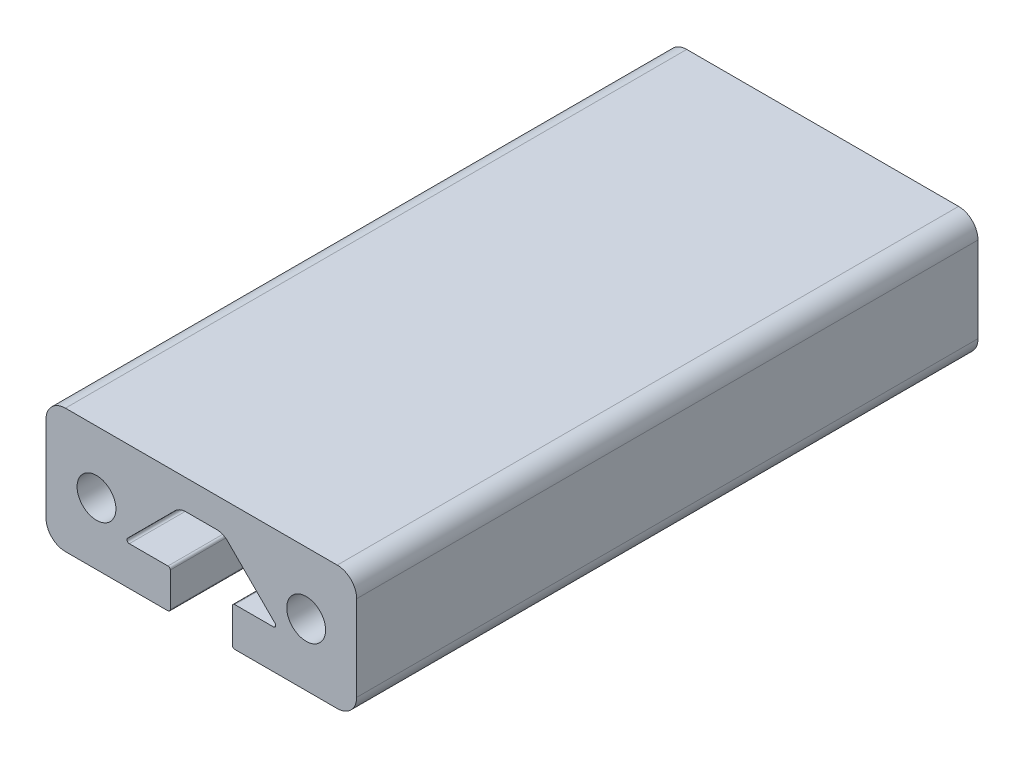
ISO-10303-21;
HEADER;
FILE_DESCRIPTION(('STEP AP214'),'2;1');
FILE_NAME('part.step','',(''),(''),'','','');
FILE_SCHEMA(('AUTOMOTIVE_DESIGN { 1 0 10303 214 1 1 1 1 }'));
ENDSEC;
DATA;
#1=APPLICATION_CONTEXT('core data for automotive mechanical design processes');
#2=APPLICATION_PROTOCOL_DEFINITION('international standard','automotive_design',2000,#1);
#3=PRODUCT_CONTEXT('',#1,'mechanical');
#4=PRODUCT('Part','Part','',(#3));
#5=PRODUCT_RELATED_PRODUCT_CATEGORY('part','',(#4));
#6=PRODUCT_DEFINITION_FORMATION('','',#4);
#7=PRODUCT_DEFINITION_CONTEXT('part definition',#1,'design');
#8=PRODUCT_DEFINITION('design','',#6,#7);
#9=PRODUCT_DEFINITION_SHAPE('','',#8);
#10=(LENGTH_UNIT() NAMED_UNIT(*) SI_UNIT(.MILLI.,.METRE.));
#11=(NAMED_UNIT(*) PLANE_ANGLE_UNIT() SI_UNIT($,.RADIAN.));
#12=(NAMED_UNIT(*) SI_UNIT($,.STERADIAN.) SOLID_ANGLE_UNIT());
#13=UNCERTAINTY_MEASURE_WITH_UNIT(LENGTH_MEASURE(1.E-05),#10,'distance_accuracy_value','');
#14=(GEOMETRIC_REPRESENTATION_CONTEXT(3) GLOBAL_UNCERTAINTY_ASSIGNED_CONTEXT((#13)) GLOBAL_UNIT_ASSIGNED_CONTEXT((#10,
#11,#12)) REPRESENTATION_CONTEXT('',''));
#15=CARTESIAN_POINT('',(0.,0.,0.));
#16=DIRECTION('',(0.,0.,1.));
#17=DIRECTION('',(1.,0.,0.));
#18=AXIS2_PLACEMENT_3D('',#15,#16,#17);
#19=CARTESIAN_POINT('',(-2.45438092578186,2.65420757363125,80.));
#20=DIRECTION('',(0.,0.,1.));
#21=DIRECTION('',(1.,0.,0.));
#22=AXIS2_PLACEMENT_3D('',#19,#20,#21);
#23=PLANE('',#22);
#24=CARTESIAN_POINT('',(-13.9828080505278,0.454207573632542,80.));
#25=DIRECTION('',(0.,0.,1.));
#26=DIRECTION('',(1.,0.,0.));
#27=AXIS2_PLACEMENT_3D('',#24,#25,#26);
#28=CIRCLE('',#27,2.49999999999995);
#29=CARTESIAN_POINT('',(-11.4828080505278,0.454207573632542,80.));
#30=VERTEX_POINT('',#29);
#31=EDGE_CURVE('E228',#30,#30,#28,.T.);
#32=ORIENTED_EDGE('',*,*,#31,.F.);
#33=EDGE_LOOP('',(#32));
#34=FACE_BOUND('',#33,.T.);
#35=CARTESIAN_POINT('',(-2.45438092578186,2.65420757363125,80.));
#36=DIRECTION('',(0.,0.,-1.));
#37=DIRECTION('',(1.,0.,0.));
#38=AXIS2_PLACEMENT_3D('',#35,#36,#37);
#39=CIRCLE('',#38,2.00000000000003);
#40=CARTESIAN_POINT('',(-3.86859448815521,4.06842113600413,80.));
#41=VERTEX_POINT('',#40);
#42=CARTESIAN_POINT('',(-2.45438092578186,4.65420757363128,80.));
#43=VERTEX_POINT('',#42);
#44=EDGE_CURVE('E271',#41,#43,#39,.T.);
#45=ORIENTED_EDGE('',*,*,#44,.T.);
#46=DIRECTION('',(1.,0.,0.));
#47=VECTOR('',#46,1.);
#48=CARTESIAN_POINT('',(-2.45438092578186,4.65420757363128,80.));
#49=LINE('',#48,#47);
#50=CARTESIAN_POINT('',(1.48876482472517,4.65420757363128,80.));
#51=VERTEX_POINT('',#50);
#52=EDGE_CURVE('E139',#43,#51,#49,.T.);
#53=ORIENTED_EDGE('',*,*,#52,.T.);
#54=CARTESIAN_POINT('',(1.48876482472517,2.65420757363115,80.));
#55=DIRECTION('',(0.,0.,-1.));
#56=DIRECTION('',(1.,0.,0.));
#57=AXIS2_PLACEMENT_3D('',#54,#55,#56);
#58=CIRCLE('',#57,2.00000000000012);
#59=CARTESIAN_POINT('',(2.90297838709831,4.06842113600438,80.));
#60=VERTEX_POINT('',#59);
#61=EDGE_CURVE('E334',#51,#60,#58,.T.);
#62=ORIENTED_EDGE('',*,*,#61,.T.);
#63=DIRECTION('',(0.707106781186548,-0.707106781186548,0.));
#64=VECTOR('',#63,1.);
#65=CARTESIAN_POINT('',(2.90297838709831,4.06842113600438,80.));
#66=LINE('',#65,#64);
#67=CARTESIAN_POINT('',(9.00505991511641,-2.03366039201372,80.));
#68=VERTEX_POINT('',#67);
#69=EDGE_CURVE('E353',#60,#68,#66,.T.);
#70=ORIENTED_EDGE('',*,*,#69,.T.);
#71=CARTESIAN_POINT('',(8.79292788076061,-2.24579242636971,80.));
#72=DIRECTION('',(0.,0.,-1.));
#73=DIRECTION('',(1.,0.,0.));
#74=AXIS2_PLACEMENT_3D('',#71,#72,#73);
#75=CIRCLE('',#74,0.299999999999902);
#76=CARTESIAN_POINT('',(8.79292788076061,-2.54579242636962,80.));
#77=VERTEX_POINT('',#76);
#78=EDGE_CURVE('E350',#68,#77,#75,.T.);
#79=ORIENTED_EDGE('',*,*,#78,.T.);
#80=DIRECTION('',(-1.,0.,0.));
#81=VECTOR('',#80,1.);
#82=CARTESIAN_POINT('',(8.79292788076061,-2.54579242636962,80.));
#83=LINE('',#82,#81);
#84=CARTESIAN_POINT('',(3.81719194947075,-2.54579242636962,80.));
#85=VERTEX_POINT('',#84);
#86=EDGE_CURVE('E352',#77,#85,#83,.T.);
#87=ORIENTED_EDGE('',*,*,#86,.T.);
#88=CARTESIAN_POINT('',(3.81719194947097,-2.84579242636919,80.));
#89=DIRECTION('',(0.,0.,1.));
#90=DIRECTION('',(1.,0.,0.));
#91=AXIS2_PLACEMENT_3D('',#88,#89,#90);
#92=CIRCLE('',#91,0.299999999999578);
#93=CARTESIAN_POINT('',(3.51719194947139,-2.8457924263695,80.));
#94=VERTEX_POINT('',#93);
#95=EDGE_CURVE('E355',#85,#94,#92,.T.);
#96=ORIENTED_EDGE('',*,*,#95,.T.);
#97=DIRECTION('',(0.,-1.,0.));
#98=VECTOR('',#97,1.);
#99=CARTESIAN_POINT('',(3.51719194947139,-2.8457924263695,80.));
#100=LINE('',#99,#98);
#101=CARTESIAN_POINT('',(3.51719194947139,-7.2457924263696,80.));
#102=VERTEX_POINT('',#101);
#103=EDGE_CURVE('E361',#94,#102,#100,.T.);
#104=ORIENTED_EDGE('',*,*,#103,.T.);
#105=CARTESIAN_POINT('',(3.81719194947108,-7.24579242636993,80.));
#106=DIRECTION('',(0.,0.,1.));
#107=DIRECTION('',(1.,0.,0.));
#108=AXIS2_PLACEMENT_3D('',#105,#106,#107);
#109=CIRCLE('',#108,0.299999999999689);
#110=CARTESIAN_POINT('',(3.81719194947064,-7.54579242636962,80.));
#111=VERTEX_POINT('',#110);
#112=EDGE_CURVE('E363',#102,#111,#109,.T.);
#113=ORIENTED_EDGE('',*,*,#112,.T.);
#114=DIRECTION('',(1.,0.,0.));
#115=VECTOR('',#114,1.);
#116=CARTESIAN_POINT('',(3.81719194947064,-7.54579242636962,80.));
#117=LINE('',#116,#115);
#118=CARTESIAN_POINT('',(17.0171919494714,-7.54579242636962,80.));
#119=VERTEX_POINT('',#118);
#120=EDGE_CURVE('E365',#111,#119,#117,.T.);
#121=ORIENTED_EDGE('',*,*,#120,.T.);
#122=CARTESIAN_POINT('',(17.0171919494714,-5.04579242636966,80.));
#123=DIRECTION('',(0.,0.,1.));
#124=DIRECTION('',(1.,0.,0.));
#125=AXIS2_PLACEMENT_3D('',#122,#123,#124);
#126=CIRCLE('',#125,2.49999999999996);
#127=CARTESIAN_POINT('',(19.5171919494714,-5.04579242636963,80.));
#128=VERTEX_POINT('',#127);
#129=EDGE_CURVE('E367',#119,#128,#126,.T.);
#130=ORIENTED_EDGE('',*,*,#129,.T.);
#131=DIRECTION('',(0.,1.,0.));
#132=VECTOR('',#131,1.);
#133=CARTESIAN_POINT('',(19.5171919494714,-5.04579242636963,80.));
#134=LINE('',#133,#132);
#135=CARTESIAN_POINT('',(19.5171919494714,5.95420757363038,80.));
#136=VERTEX_POINT('',#135);
#137=EDGE_CURVE('E369',#128,#136,#134,.T.);
#138=ORIENTED_EDGE('',*,*,#137,.T.);
#139=CARTESIAN_POINT('',(17.0171919494714,5.95420757363263,80.));
#140=DIRECTION('',(0.,0.,1.));
#141=DIRECTION('',(1.,0.,0.));
#142=AXIS2_PLACEMENT_3D('',#139,#140,#141);
#143=CIRCLE('',#142,2.49999999999994);
#144=CARTESIAN_POINT('',(17.0171919494722,8.45420757363257,80.));
#145=VERTEX_POINT('',#144);
#146=EDGE_CURVE('E371',#136,#145,#143,.T.);
#147=ORIENTED_EDGE('',*,*,#146,.T.);
#148=DIRECTION('',(-1.,0.,0.));
#149=VECTOR('',#148,1.);
#150=CARTESIAN_POINT('',(17.0171919494722,8.45420757363255,80.));
#151=LINE('',#150,#149);
#152=CARTESIAN_POINT('',(-17.9828080505278,8.45420757363255,80.));
#153=VERTEX_POINT('',#152);
#154=EDGE_CURVE('E373',#145,#153,#151,.T.);
#155=ORIENTED_EDGE('',*,*,#154,.T.);
#156=CARTESIAN_POINT('',(-17.9828080505278,5.95420757363246,80.));
#157=DIRECTION('',(0.,0.,1.));
#158=DIRECTION('',(1.,0.,0.));
#159=AXIS2_PLACEMENT_3D('',#156,#157,#158);
#160=CIRCLE('',#159,2.50000000000013);
#161=CARTESIAN_POINT('',(-20.4828080505279,5.95420757363255,80.));
#162=VERTEX_POINT('',#161);
#163=EDGE_CURVE('E375',#153,#162,#160,.T.);
#164=ORIENTED_EDGE('',*,*,#163,.T.);
#165=DIRECTION('',(0.,-1.,0.));
#166=VECTOR('',#165,1.);
#167=CARTESIAN_POINT('',(-20.4828080505279,5.95420757363255,80.));
#168=LINE('',#167,#166);
#169=CARTESIAN_POINT('',(-20.4828080505279,-5.04579242636746,80.));
#170=VERTEX_POINT('',#169);
#171=EDGE_CURVE('E377',#162,#170,#168,.T.);
#172=ORIENTED_EDGE('',*,*,#171,.T.);
#173=CARTESIAN_POINT('',(-17.9828080505278,-5.04579242636738,80.));
#174=DIRECTION('',(0.,0.,1.));
#175=DIRECTION('',(1.,0.,0.));
#176=AXIS2_PLACEMENT_3D('',#173,#174,#175);
#177=CIRCLE('',#176,2.50000000000013);
#178=CARTESIAN_POINT('',(-17.9828080505278,-7.54579242636751,80.));
#179=VERTEX_POINT('',#178);
#180=EDGE_CURVE('E379',#170,#179,#177,.T.);
#181=ORIENTED_EDGE('',*,*,#180,.T.);
#182=DIRECTION('',(1.,0.,0.));
#183=VECTOR('',#182,1.);
#184=CARTESIAN_POINT('',(-17.9828080505278,-7.54579242636746,80.));
#185=LINE('',#184,#183);
#186=CARTESIAN_POINT('',(-4.78280805052722,-7.54579242636746,80.));
#187=VERTEX_POINT('',#186);
#188=EDGE_CURVE('E381',#179,#187,#185,.T.);
#189=ORIENTED_EDGE('',*,*,#188,.T.);
#190=CARTESIAN_POINT('',(-4.78280805052766,-7.24579242636783,80.));
#191=DIRECTION('',(0.,0.,1.));
#192=DIRECTION('',(1.,0.,0.));
#193=AXIS2_PLACEMENT_3D('',#190,#191,#192);
#194=CIRCLE('',#193,0.299999999999689);
#195=CARTESIAN_POINT('',(-4.48280805052798,-7.2457924263675,80.));
#196=VERTEX_POINT('',#195);
#197=EDGE_CURVE('E383',#187,#196,#194,.T.);
#198=ORIENTED_EDGE('',*,*,#197,.T.);
#199=DIRECTION('',(0.,1.,0.));
#200=VECTOR('',#199,1.);
#201=CARTESIAN_POINT('',(-4.48280805052792,-7.2457924263675,80.));
#202=LINE('',#201,#200);
#203=CARTESIAN_POINT('',(-4.48280805052792,-2.8457924263674,80.));
#204=VERTEX_POINT('',#203);
#205=EDGE_CURVE('E385',#196,#204,#202,.T.);
#206=ORIENTED_EDGE('',*,*,#205,.T.);
#207=CARTESIAN_POINT('',(-4.78280805052722,-2.8457924263674,80.));
#208=DIRECTION('',(0.,0.,1.));
#209=DIRECTION('',(1.,0.,0.));
#210=AXIS2_PLACEMENT_3D('',#207,#208,#209);
#211=CIRCLE('',#210,0.29999999999962);
#212=CARTESIAN_POINT('',(-4.78280805052722,-2.54579242636778,80.));
#213=VERTEX_POINT('',#212);
#214=EDGE_CURVE('E206',#204,#213,#211,.T.);
#215=ORIENTED_EDGE('',*,*,#214,.T.);
#216=DIRECTION('',(-1.,0.,0.));
#217=VECTOR('',#216,1.);
#218=CARTESIAN_POINT('',(-9.75854398181686,-2.54579242636752,80.));
#219=LINE('',#218,#217);
#220=CARTESIAN_POINT('',(-9.75854398181686,-2.54579242636752,80.));
#221=VERTEX_POINT('',#220);
#222=EDGE_CURVE('E200',#213,#221,#219,.T.);
#223=ORIENTED_EDGE('',*,*,#222,.T.);
#224=CARTESIAN_POINT('',(-9.75854398181686,-2.24579242636847,80.));
#225=DIRECTION('',(0.,0.,-1.));
#226=DIRECTION('',(1.,0.,0.));
#227=AXIS2_PLACEMENT_3D('',#224,#225,#226);
#228=CIRCLE('',#227,0.299999999999174);
#229=CARTESIAN_POINT('',(-9.97067601617127,-2.03366039201212,80.));
#230=VERTEX_POINT('',#229);
#231=EDGE_CURVE('E204',#221,#230,#228,.T.);
#232=ORIENTED_EDGE('',*,*,#231,.T.);
#233=DIRECTION('',(0.707106781186547,0.707106781186547,0.));
#234=VECTOR('',#233,1.);
#235=CARTESIAN_POINT('',(-9.97067601617136,-2.03366039201203,80.));
#236=LINE('',#235,#234);
#237=EDGE_CURVE('E48',#230,#41,#236,.T.);
#238=ORIENTED_EDGE('',*,*,#237,.T.);
#239=EDGE_LOOP('',(#45,#53,#62,#70,#79,#87,#96,#104,#113,#121,#130,#138,#147,#155,#164,#172,
#181,#189,#198,#206,#215,#223,#232,#238));
#240=FACE_BOUND('',#239,.T.);
#241=CARTESIAN_POINT('',(13.0171919494722,0.454207573632542,80.));
#242=DIRECTION('',(0.,0.,1.));
#243=DIRECTION('',(1.,0.,0.));
#244=AXIS2_PLACEMENT_3D('',#241,#242,#243);
#245=CIRCLE('',#244,2.49999999999995);
#246=CARTESIAN_POINT('',(15.5171919494721,0.454207573632542,80.));
#247=VERTEX_POINT('',#246);
#248=EDGE_CURVE('E428',#247,#247,#245,.T.);
#249=ORIENTED_EDGE('',*,*,#248,.F.);
#250=EDGE_LOOP('',(#249));
#251=FACE_BOUND('',#250,.T.);
#252=ADVANCED_FACE('F31',(#34,#240,#251),#23,.T.);
#253=CARTESIAN_POINT('',(-2.45438092578186,2.65420757363125,0.));
#254=DIRECTION('',(0.,0.,1.));
#255=DIRECTION('',(1.,0.,0.));
#256=AXIS2_PLACEMENT_3D('',#253,#254,#255);
#257=PLANE('',#256);
#258=CARTESIAN_POINT('',(-13.9828080505278,0.454207573632542,0.));
#259=DIRECTION('',(0.,0.,1.));
#260=DIRECTION('',(1.,0.,0.));
#261=AXIS2_PLACEMENT_3D('',#258,#259,#260);
#262=CIRCLE('',#261,2.49999999999995);
#263=CARTESIAN_POINT('',(-11.4828080505278,0.454207573632542,0.));
#264=VERTEX_POINT('',#263);
#265=EDGE_CURVE('E433',#264,#264,#262,.T.);
#266=ORIENTED_EDGE('',*,*,#265,.T.);
#267=EDGE_LOOP('',(#266));
#268=FACE_BOUND('',#267,.T.);
#269=CARTESIAN_POINT('',(-2.45438092578186,2.65420757363125,0.));
#270=DIRECTION('',(0.,0.,-1.));
#271=DIRECTION('',(1.,0.,0.));
#272=AXIS2_PLACEMENT_3D('',#269,#270,#271);
#273=CIRCLE('',#272,2.00000000000003);
#274=CARTESIAN_POINT('',(-3.86859448815521,4.06842113600413,0.));
#275=VERTEX_POINT('',#274);
#276=CARTESIAN_POINT('',(-2.45438092578186,4.65420757363128,0.));
#277=VERTEX_POINT('',#276);
#278=EDGE_CURVE('E224',#275,#277,#273,.T.);
#279=ORIENTED_EDGE('',*,*,#278,.F.);
#280=DIRECTION('',(0.707106781186547,0.707106781186547,0.));
#281=VECTOR('',#280,1.);
#282=CARTESIAN_POINT('',(-9.97067601617136,-2.03366039201203,0.));
#283=LINE('',#282,#281);
#284=CARTESIAN_POINT('',(-9.97067601617127,-2.03366039201212,0.));
#285=VERTEX_POINT('',#284);
#286=EDGE_CURVE('E131',#285,#275,#283,.T.);
#287=ORIENTED_EDGE('',*,*,#286,.F.);
#288=CARTESIAN_POINT('',(-9.75854398181686,-2.24579242636847,0.));
#289=DIRECTION('',(0.,0.,-1.));
#290=DIRECTION('',(1.,0.,0.));
#291=AXIS2_PLACEMENT_3D('',#288,#289,#290);
#292=CIRCLE('',#291,0.299999999999174);
#293=CARTESIAN_POINT('',(-9.75854398181686,-2.54579242636752,0.));
#294=VERTEX_POINT('',#293);
#295=EDGE_CURVE('E125',#294,#285,#292,.T.);
#296=ORIENTED_EDGE('',*,*,#295,.F.);
#297=DIRECTION('',(-1.,0.,0.));
#298=VECTOR('',#297,1.);
#299=CARTESIAN_POINT('',(-9.75854398181686,-2.54579242636752,0.));
#300=LINE('',#299,#298);
#301=CARTESIAN_POINT('',(-4.78280805052722,-2.54579242636778,0.));
#302=VERTEX_POINT('',#301);
#303=EDGE_CURVE('E214',#302,#294,#300,.T.);
#304=ORIENTED_EDGE('',*,*,#303,.F.);
#305=CARTESIAN_POINT('',(-4.78280805052722,-2.8457924263674,0.));
#306=DIRECTION('',(0.,0.,1.));
#307=DIRECTION('',(1.,0.,0.));
#308=AXIS2_PLACEMENT_3D('',#305,#306,#307);
#309=CIRCLE('',#308,0.29999999999962);
#310=CARTESIAN_POINT('',(-4.48280805052792,-2.8457924263674,0.));
#311=VERTEX_POINT('',#310);
#312=EDGE_CURVE('E266',#311,#302,#309,.T.);
#313=ORIENTED_EDGE('',*,*,#312,.F.);
#314=DIRECTION('',(0.,1.,0.));
#315=VECTOR('',#314,1.);
#316=CARTESIAN_POINT('',(-4.48280805052792,-7.2457924263675,0.));
#317=LINE('',#316,#315);
#318=CARTESIAN_POINT('',(-4.48280805052798,-7.2457924263675,0.));
#319=VERTEX_POINT('',#318);
#320=EDGE_CURVE('E264',#319,#311,#317,.T.);
#321=ORIENTED_EDGE('',*,*,#320,.F.);
#322=CARTESIAN_POINT('',(-4.78280805052766,-7.24579242636783,0.));
#323=DIRECTION('',(0.,0.,1.));
#324=DIRECTION('',(1.,0.,0.));
#325=AXIS2_PLACEMENT_3D('',#322,#323,#324);
#326=CIRCLE('',#325,0.299999999999689);
#327=CARTESIAN_POINT('',(-4.78280805052722,-7.54579242636746,0.));
#328=VERTEX_POINT('',#327);
#329=EDGE_CURVE('E262',#328,#319,#326,.T.);
#330=ORIENTED_EDGE('',*,*,#329,.F.);
#331=DIRECTION('',(1.,0.,0.));
#332=VECTOR('',#331,1.);
#333=CARTESIAN_POINT('',(-17.9828080505278,-7.54579242636746,0.));
#334=LINE('',#333,#332);
#335=CARTESIAN_POINT('',(-17.9828080505278,-7.54579242636751,0.));
#336=VERTEX_POINT('',#335);
#337=EDGE_CURVE('E260',#336,#328,#334,.T.);
#338=ORIENTED_EDGE('',*,*,#337,.F.);
#339=CARTESIAN_POINT('',(-17.9828080505278,-5.04579242636738,0.));
#340=DIRECTION('',(0.,0.,1.));
#341=DIRECTION('',(1.,0.,0.));
#342=AXIS2_PLACEMENT_3D('',#339,#340,#341);
#343=CIRCLE('',#342,2.50000000000013);
#344=CARTESIAN_POINT('',(-20.4828080505279,-5.04579242636746,0.));
#345=VERTEX_POINT('',#344);
#346=EDGE_CURVE('E258',#345,#336,#343,.T.);
#347=ORIENTED_EDGE('',*,*,#346,.F.);
#348=DIRECTION('',(0.,-1.,0.));
#349=VECTOR('',#348,1.);
#350=CARTESIAN_POINT('',(-20.4828080505279,5.95420757363255,0.));
#351=LINE('',#350,#349);
#352=CARTESIAN_POINT('',(-20.4828080505279,5.95420757363255,0.));
#353=VERTEX_POINT('',#352);
#354=EDGE_CURVE('E256',#353,#345,#351,.T.);
#355=ORIENTED_EDGE('',*,*,#354,.F.);
#356=CARTESIAN_POINT('',(-17.9828080505278,5.95420757363246,0.));
#357=DIRECTION('',(0.,0.,1.));
#358=DIRECTION('',(1.,0.,0.));
#359=AXIS2_PLACEMENT_3D('',#356,#357,#358);
#360=CIRCLE('',#359,2.50000000000013);
#361=CARTESIAN_POINT('',(-17.9828080505278,8.45420757363255,0.));
#362=VERTEX_POINT('',#361);
#363=EDGE_CURVE('E254',#362,#353,#360,.T.);
#364=ORIENTED_EDGE('',*,*,#363,.F.);
#365=DIRECTION('',(-1.,0.,0.));
#366=VECTOR('',#365,1.);
#367=CARTESIAN_POINT('',(17.0171919494722,8.45420757363255,0.));
#368=LINE('',#367,#366);
#369=CARTESIAN_POINT('',(17.0171919494722,8.45420757363257,0.));
#370=VERTEX_POINT('',#369);
#371=EDGE_CURVE('E252',#370,#362,#368,.T.);
#372=ORIENTED_EDGE('',*,*,#371,.F.);
#373=CARTESIAN_POINT('',(17.0171919494714,5.95420757363263,0.));
#374=DIRECTION('',(0.,0.,1.));
#375=DIRECTION('',(1.,0.,0.));
#376=AXIS2_PLACEMENT_3D('',#373,#374,#375);
#377=CIRCLE('',#376,2.49999999999994);
#378=CARTESIAN_POINT('',(19.5171919494714,5.95420757363038,0.));
#379=VERTEX_POINT('',#378);
#380=EDGE_CURVE('E250',#379,#370,#377,.T.);
#381=ORIENTED_EDGE('',*,*,#380,.F.);
#382=DIRECTION('',(0.,1.,0.));
#383=VECTOR('',#382,1.);
#384=CARTESIAN_POINT('',(19.5171919494714,-5.04579242636963,0.));
#385=LINE('',#384,#383);
#386=CARTESIAN_POINT('',(19.5171919494714,-5.04579242636963,0.));
#387=VERTEX_POINT('',#386);
#388=EDGE_CURVE('E248',#387,#379,#385,.T.);
#389=ORIENTED_EDGE('',*,*,#388,.F.);
#390=CARTESIAN_POINT('',(17.0171919494714,-5.04579242636966,0.));
#391=DIRECTION('',(0.,0.,1.));
#392=DIRECTION('',(1.,0.,0.));
#393=AXIS2_PLACEMENT_3D('',#390,#391,#392);
#394=CIRCLE('',#393,2.49999999999996);
#395=CARTESIAN_POINT('',(17.0171919494714,-7.54579242636962,0.));
#396=VERTEX_POINT('',#395);
#397=EDGE_CURVE('E246',#396,#387,#394,.T.);
#398=ORIENTED_EDGE('',*,*,#397,.F.);
#399=DIRECTION('',(1.,0.,0.));
#400=VECTOR('',#399,1.);
#401=CARTESIAN_POINT('',(3.81719194947064,-7.54579242636962,0.));
#402=LINE('',#401,#400);
#403=CARTESIAN_POINT('',(3.81719194947064,-7.54579242636962,0.));
#404=VERTEX_POINT('',#403);
#405=EDGE_CURVE('E244',#404,#396,#402,.T.);
#406=ORIENTED_EDGE('',*,*,#405,.F.);
#407=CARTESIAN_POINT('',(3.81719194947108,-7.24579242636993,0.));
#408=DIRECTION('',(0.,0.,1.));
#409=DIRECTION('',(1.,0.,0.));
#410=AXIS2_PLACEMENT_3D('',#407,#408,#409);
#411=CIRCLE('',#410,0.299999999999689);
#412=CARTESIAN_POINT('',(3.51719194947139,-7.2457924263696,0.));
#413=VERTEX_POINT('',#412);
#414=EDGE_CURVE('E242',#413,#404,#411,.T.);
#415=ORIENTED_EDGE('',*,*,#414,.F.);
#416=DIRECTION('',(0.,-1.,0.));
#417=VECTOR('',#416,1.);
#418=CARTESIAN_POINT('',(3.51719194947139,-2.8457924263695,0.));
#419=LINE('',#418,#417);
#420=CARTESIAN_POINT('',(3.51719194947139,-2.8457924263695,0.));
#421=VERTEX_POINT('',#420);
#422=EDGE_CURVE('E240',#421,#413,#419,.T.);
#423=ORIENTED_EDGE('',*,*,#422,.F.);
#424=CARTESIAN_POINT('',(3.81719194947097,-2.84579242636919,0.));
#425=DIRECTION('',(0.,0.,1.));
#426=DIRECTION('',(1.,0.,0.));
#427=AXIS2_PLACEMENT_3D('',#424,#425,#426);
#428=CIRCLE('',#427,0.299999999999578);
#429=CARTESIAN_POINT('',(3.81719194947075,-2.54579242636962,0.));
#430=VERTEX_POINT('',#429);
#431=EDGE_CURVE('E238',#430,#421,#428,.T.);
#432=ORIENTED_EDGE('',*,*,#431,.F.);
#433=DIRECTION('',(-1.,0.,0.));
#434=VECTOR('',#433,1.);
#435=CARTESIAN_POINT('',(8.79292788076061,-2.54579242636962,0.));
#436=LINE('',#435,#434);
#437=CARTESIAN_POINT('',(8.79292788076061,-2.54579242636962,0.));
#438=VERTEX_POINT('',#437);
#439=EDGE_CURVE('E236',#438,#430,#436,.T.);
#440=ORIENTED_EDGE('',*,*,#439,.F.);
#441=CARTESIAN_POINT('',(8.79292788076061,-2.24579242636971,0.));
#442=DIRECTION('',(0.,0.,-1.));
#443=DIRECTION('',(1.,0.,0.));
#444=AXIS2_PLACEMENT_3D('',#441,#442,#443);
#445=CIRCLE('',#444,0.299999999999902);
#446=CARTESIAN_POINT('',(9.00505991511641,-2.03366039201372,0.));
#447=VERTEX_POINT('',#446);
#448=EDGE_CURVE('E234',#447,#438,#445,.T.);
#449=ORIENTED_EDGE('',*,*,#448,.F.);
#450=DIRECTION('',(0.707106781186548,-0.707106781186548,0.));
#451=VECTOR('',#450,1.);
#452=CARTESIAN_POINT('',(2.90297838709831,4.06842113600438,0.));
#453=LINE('',#452,#451);
#454=CARTESIAN_POINT('',(2.90297838709831,4.06842113600438,0.));
#455=VERTEX_POINT('',#454);
#456=EDGE_CURVE('E232',#455,#447,#453,.T.);
#457=ORIENTED_EDGE('',*,*,#456,.F.);
#458=CARTESIAN_POINT('',(1.48876482472517,2.65420757363115,0.));
#459=DIRECTION('',(0.,0.,-1.));
#460=DIRECTION('',(1.,0.,0.));
#461=AXIS2_PLACEMENT_3D('',#458,#459,#460);
#462=CIRCLE('',#461,2.00000000000012);
#463=CARTESIAN_POINT('',(1.48876482472517,4.65420757363128,0.));
#464=VERTEX_POINT('',#463);
#465=EDGE_CURVE('E230',#464,#455,#462,.T.);
#466=ORIENTED_EDGE('',*,*,#465,.F.);
#467=DIRECTION('',(1.,0.,0.));
#468=VECTOR('',#467,1.);
#469=CARTESIAN_POINT('',(-2.45438092578186,4.65420757363128,0.));
#470=LINE('',#469,#468);
#471=EDGE_CURVE('E227',#277,#464,#470,.T.);
#472=ORIENTED_EDGE('',*,*,#471,.F.);
#473=EDGE_LOOP('',(#279,#287,#296,#304,#313,#321,#330,#338,#347,#355,#364,#372,#381,#389,#398,
#406,#415,#423,#432,#440,#449,#457,#466,#472));
#474=FACE_BOUND('',#473,.T.);
#475=CARTESIAN_POINT('',(13.0171919494722,0.454207573632542,0.));
#476=DIRECTION('',(0.,0.,1.));
#477=DIRECTION('',(1.,0.,0.));
#478=AXIS2_PLACEMENT_3D('',#475,#476,#477);
#479=CIRCLE('',#478,2.49999999999995);
#480=CARTESIAN_POINT('',(15.5171919494721,0.454207573632542,0.));
#481=VERTEX_POINT('',#480);
#482=EDGE_CURVE('E431',#481,#481,#479,.T.);
#483=ORIENTED_EDGE('',*,*,#482,.T.);
#484=EDGE_LOOP('',(#483));
#485=FACE_BOUND('',#484,.T.);
#486=ADVANCED_FACE('F338',(#268,#474,#485),#257,.F.);
#487=CARTESIAN_POINT('',(-2.45438092578186,2.65420757363125,80.));
#488=DIRECTION('',(0.,0.,-1.));
#489=DIRECTION('',(-1.,0.,0.));
#490=AXIS2_PLACEMENT_3D('',#487,#488,#489);
#491=CYLINDRICAL_SURFACE('',#490,2.00000000000003);
#492=ORIENTED_EDGE('',*,*,#278,.T.);
#493=DIRECTION('',(0.,0.,-1.));
#494=VECTOR('',#493,1.);
#495=CARTESIAN_POINT('',(-2.45438092578186,4.65420757363128,80.));
#496=LINE('',#495,#494);
#497=EDGE_CURVE('E11',#43,#277,#496,.T.);
#498=ORIENTED_EDGE('',*,*,#497,.F.);
#499=ORIENTED_EDGE('',*,*,#44,.F.);
#500=DIRECTION('',(0.,0.,-1.));
#501=VECTOR('',#500,1.);
#502=CARTESIAN_POINT('',(-3.86859448815521,4.06842113600413,80.));
#503=LINE('',#502,#501);
#504=EDGE_CURVE('E220',#41,#275,#503,.T.);
#505=ORIENTED_EDGE('',*,*,#504,.T.);
#506=EDGE_LOOP('',(#492,#498,#499,#505));
#507=FACE_BOUND('',#506,.T.);
#508=ADVANCED_FACE('F33',(#507),#491,.F.);
#509=CARTESIAN_POINT('',(-2.45438092578186,4.65420757363128,80.));
#510=DIRECTION('',(0.,1.,0.));
#511=DIRECTION('',(0.,0.,1.));
#512=AXIS2_PLACEMENT_3D('',#509,#510,#511);
#513=PLANE('',#512);
#514=ORIENTED_EDGE('',*,*,#471,.T.);
#515=DIRECTION('',(0.,0.,-1.));
#516=VECTOR('',#515,1.);
#517=CARTESIAN_POINT('',(1.48876482472517,4.65420757363128,80.));
#518=LINE('',#517,#516);
#519=EDGE_CURVE('E40',#51,#464,#518,.T.);
#520=ORIENTED_EDGE('',*,*,#519,.F.);
#521=ORIENTED_EDGE('',*,*,#52,.F.);
#522=ORIENTED_EDGE('',*,*,#497,.T.);
#523=EDGE_LOOP('',(#514,#520,#521,#522));
#524=FACE_BOUND('',#523,.T.);
#525=ADVANCED_FACE('F646',(#524),#513,.F.);
#526=CARTESIAN_POINT('',(1.48876482472517,2.65420757363115,80.));
#527=DIRECTION('',(0.,0.,-1.));
#528=DIRECTION('',(-1.,0.,0.));
#529=AXIS2_PLACEMENT_3D('',#526,#527,#528);
#530=CYLINDRICAL_SURFACE('',#529,2.00000000000012);
#531=ORIENTED_EDGE('',*,*,#465,.T.);
#532=DIRECTION('',(0.,0.,-1.));
#533=VECTOR('',#532,1.);
#534=CARTESIAN_POINT('',(2.90297838709831,4.06842113600438,80.));
#535=LINE('',#534,#533);
#536=EDGE_CURVE('E326',#60,#455,#535,.T.);
#537=ORIENTED_EDGE('',*,*,#536,.F.);
#538=ORIENTED_EDGE('',*,*,#61,.F.);
#539=ORIENTED_EDGE('',*,*,#519,.T.);
#540=EDGE_LOOP('',(#531,#537,#538,#539));
#541=FACE_BOUND('',#540,.T.);
#542=ADVANCED_FACE('F332',(#541),#530,.F.);
#543=CARTESIAN_POINT('',(2.90297838709831,4.06842113600438,80.));
#544=DIRECTION('',(0.707106781186548,0.707106781186548,0.));
#545=DIRECTION('',(-0.707106781186548,0.707106781186548,0.));
#546=AXIS2_PLACEMENT_3D('',#543,#544,#545);
#547=PLANE('',#546);
#548=ORIENTED_EDGE('',*,*,#456,.T.);
#549=DIRECTION('',(0.,0.,-1.));
#550=VECTOR('',#549,1.);
#551=CARTESIAN_POINT('',(9.00505991511641,-2.03366039201372,80.));
#552=LINE('',#551,#550);
#553=EDGE_CURVE('E323',#68,#447,#552,.T.);
#554=ORIENTED_EDGE('',*,*,#553,.F.);
#555=ORIENTED_EDGE('',*,*,#69,.F.);
#556=ORIENTED_EDGE('',*,*,#536,.T.);
#557=EDGE_LOOP('',(#548,#554,#555,#556));
#558=FACE_BOUND('',#557,.T.);
#559=ADVANCED_FACE('F344',(#558),#547,.F.);
#560=CARTESIAN_POINT('',(8.79292788076061,-2.24579242636971,80.));
#561=DIRECTION('',(0.,0.,-1.));
#562=DIRECTION('',(-1.,0.,0.));
#563=AXIS2_PLACEMENT_3D('',#560,#561,#562);
#564=CYLINDRICAL_SURFACE('',#563,0.299999999999902);
#565=ORIENTED_EDGE('',*,*,#448,.T.);
#566=DIRECTION('',(0.,0.,-1.));
#567=VECTOR('',#566,1.);
#568=CARTESIAN_POINT('',(8.79292788076061,-2.54579242636962,80.));
#569=LINE('',#568,#567);
#570=EDGE_CURVE('E320',#77,#438,#569,.T.);
#571=ORIENTED_EDGE('',*,*,#570,.F.);
#572=ORIENTED_EDGE('',*,*,#78,.F.);
#573=ORIENTED_EDGE('',*,*,#553,.T.);
#574=EDGE_LOOP('',(#565,#571,#572,#573));
#575=FACE_BOUND('',#574,.T.);
#576=ADVANCED_FACE('F348',(#575),#564,.F.);
#577=CARTESIAN_POINT('',(8.79292788076061,-2.54579242636962,80.));
#578=DIRECTION('',(0.,-1.,0.));
#579=DIRECTION('',(0.,0.,-1.));
#580=AXIS2_PLACEMENT_3D('',#577,#578,#579);
#581=PLANE('',#580);
#582=ORIENTED_EDGE('',*,*,#439,.T.);
#583=DIRECTION('',(0.,0.,-1.));
#584=VECTOR('',#583,1.);
#585=CARTESIAN_POINT('',(3.81719194947075,-2.54579242636962,80.));
#586=LINE('',#585,#584);
#587=EDGE_CURVE('E317',#85,#430,#586,.T.);
#588=ORIENTED_EDGE('',*,*,#587,.F.);
#589=ORIENTED_EDGE('',*,*,#86,.F.);
#590=ORIENTED_EDGE('',*,*,#570,.T.);
#591=EDGE_LOOP('',(#582,#588,#589,#590));
#592=FACE_BOUND('',#591,.T.);
#593=ADVANCED_FACE('F611',(#592),#581,.F.);
#594=CARTESIAN_POINT('',(3.81719194947097,-2.84579242636919,80.));
#595=DIRECTION('',(0.,0.,-1.));
#596=DIRECTION('',(-1.,0.,0.));
#597=AXIS2_PLACEMENT_3D('',#594,#595,#596);
#598=CYLINDRICAL_SURFACE('',#597,0.299999999999578);
#599=ORIENTED_EDGE('',*,*,#431,.T.);
#600=DIRECTION('',(0.,0.,-1.));
#601=VECTOR('',#600,1.);
#602=CARTESIAN_POINT('',(3.51719194947139,-2.8457924263695,80.));
#603=LINE('',#602,#601);
#604=EDGE_CURVE('E314',#94,#421,#603,.T.);
#605=ORIENTED_EDGE('',*,*,#604,.F.);
#606=ORIENTED_EDGE('',*,*,#95,.F.);
#607=ORIENTED_EDGE('',*,*,#587,.T.);
#608=EDGE_LOOP('',(#599,#605,#606,#607));
#609=FACE_BOUND('',#608,.T.);
#610=ADVANCED_FACE('F601',(#609),#598,.T.);
#611=CARTESIAN_POINT('',(3.51719194947139,-2.8457924263695,80.));
#612=DIRECTION('',(1.,0.,0.));
#613=DIRECTION('',(0.,0.,-1.));
#614=AXIS2_PLACEMENT_3D('',#611,#612,#613);
#615=PLANE('',#614);
#616=ORIENTED_EDGE('',*,*,#422,.T.);
#617=DIRECTION('',(0.,0.,-1.));
#618=VECTOR('',#617,1.);
#619=CARTESIAN_POINT('',(3.51719194947139,-7.2457924263696,80.));
#620=LINE('',#619,#618);
#621=EDGE_CURVE('E311',#102,#413,#620,.T.);
#622=ORIENTED_EDGE('',*,*,#621,.F.);
#623=ORIENTED_EDGE('',*,*,#103,.F.);
#624=ORIENTED_EDGE('',*,*,#604,.T.);
#625=EDGE_LOOP('',(#616,#622,#623,#624));
#626=FACE_BOUND('',#625,.T.);
#627=ADVANCED_FACE('F591',(#626),#615,.F.);
#628=CARTESIAN_POINT('',(3.81719194947108,-7.24579242636993,80.));
#629=DIRECTION('',(0.,0.,-1.));
#630=DIRECTION('',(-1.,0.,0.));
#631=AXIS2_PLACEMENT_3D('',#628,#629,#630);
#632=CYLINDRICAL_SURFACE('',#631,0.299999999999689);
#633=ORIENTED_EDGE('',*,*,#414,.T.);
#634=DIRECTION('',(0.,0.,-1.));
#635=VECTOR('',#634,1.);
#636=CARTESIAN_POINT('',(3.81719194947064,-7.54579242636962,80.));
#637=LINE('',#636,#635);
#638=EDGE_CURVE('E308',#111,#404,#637,.T.);
#639=ORIENTED_EDGE('',*,*,#638,.F.);
#640=ORIENTED_EDGE('',*,*,#112,.F.);
#641=ORIENTED_EDGE('',*,*,#621,.T.);
#642=EDGE_LOOP('',(#633,#639,#640,#641));
#643=FACE_BOUND('',#642,.T.);
#644=ADVANCED_FACE('F581',(#643),#632,.T.);
#645=CARTESIAN_POINT('',(3.81719194947064,-7.54579242636962,80.));
#646=DIRECTION('',(0.,1.,0.));
#647=DIRECTION('',(0.,0.,1.));
#648=AXIS2_PLACEMENT_3D('',#645,#646,#647);
#649=PLANE('',#648);
#650=ORIENTED_EDGE('',*,*,#405,.T.);
#651=DIRECTION('',(0.,0.,-1.));
#652=VECTOR('',#651,1.);
#653=CARTESIAN_POINT('',(17.0171919494714,-7.54579242636962,80.));
#654=LINE('',#653,#652);
#655=EDGE_CURVE('E305',#119,#396,#654,.T.);
#656=ORIENTED_EDGE('',*,*,#655,.F.);
#657=ORIENTED_EDGE('',*,*,#120,.F.);
#658=ORIENTED_EDGE('',*,*,#638,.T.);
#659=EDGE_LOOP('',(#650,#656,#657,#658));
#660=FACE_BOUND('',#659,.T.);
#661=ADVANCED_FACE('F571',(#660),#649,.F.);
#662=CARTESIAN_POINT('',(17.0171919494714,-5.04579242636966,80.));
#663=DIRECTION('',(0.,0.,-1.));
#664=DIRECTION('',(-1.,0.,0.));
#665=AXIS2_PLACEMENT_3D('',#662,#663,#664);
#666=CYLINDRICAL_SURFACE('',#665,2.49999999999996);
#667=ORIENTED_EDGE('',*,*,#397,.T.);
#668=DIRECTION('',(0.,0.,-1.));
#669=VECTOR('',#668,1.);
#670=CARTESIAN_POINT('',(19.5171919494714,-5.04579242636963,80.));
#671=LINE('',#670,#669);
#672=EDGE_CURVE('E302',#128,#387,#671,.T.);
#673=ORIENTED_EDGE('',*,*,#672,.F.);
#674=ORIENTED_EDGE('',*,*,#129,.F.);
#675=ORIENTED_EDGE('',*,*,#655,.T.);
#676=EDGE_LOOP('',(#667,#673,#674,#675));
#677=FACE_BOUND('',#676,.T.);
#678=ADVANCED_FACE('F561',(#677),#666,.T.);
#679=CARTESIAN_POINT('',(19.5171919494714,-5.04579242636963,80.));
#680=DIRECTION('',(-1.,0.,0.));
#681=DIRECTION('',(0.,0.,1.));
#682=AXIS2_PLACEMENT_3D('',#679,#680,#681);
#683=PLANE('',#682);
#684=ORIENTED_EDGE('',*,*,#388,.T.);
#685=DIRECTION('',(0.,0.,-1.));
#686=VECTOR('',#685,1.);
#687=CARTESIAN_POINT('',(19.5171919494714,5.95420757363038,80.));
#688=LINE('',#687,#686);
#689=EDGE_CURVE('E299',#136,#379,#688,.T.);
#690=ORIENTED_EDGE('',*,*,#689,.F.);
#691=ORIENTED_EDGE('',*,*,#137,.F.);
#692=ORIENTED_EDGE('',*,*,#672,.T.);
#693=EDGE_LOOP('',(#684,#690,#691,#692));
#694=FACE_BOUND('',#693,.T.);
#695=ADVANCED_FACE('F551',(#694),#683,.F.);
#696=CARTESIAN_POINT('',(17.0171919494714,5.95420757363263,80.));
#697=DIRECTION('',(0.,0.,-1.));
#698=DIRECTION('',(-1.,0.,0.));
#699=AXIS2_PLACEMENT_3D('',#696,#697,#698);
#700=CYLINDRICAL_SURFACE('',#699,2.49999999999994);
#701=ORIENTED_EDGE('',*,*,#380,.T.);
#702=DIRECTION('',(0.,0.,-1.));
#703=VECTOR('',#702,1.);
#704=CARTESIAN_POINT('',(17.0171919494722,8.45420757363257,80.));
#705=LINE('',#704,#703);
#706=EDGE_CURVE('E296',#145,#370,#705,.T.);
#707=ORIENTED_EDGE('',*,*,#706,.F.);
#708=ORIENTED_EDGE('',*,*,#146,.F.);
#709=ORIENTED_EDGE('',*,*,#689,.T.);
#710=EDGE_LOOP('',(#701,#707,#708,#709));
#711=FACE_BOUND('',#710,.T.);
#712=ADVANCED_FACE('F541',(#711),#700,.T.);
#713=CARTESIAN_POINT('',(17.0171919494722,8.45420757363255,80.));
#714=DIRECTION('',(0.,-1.,0.));
#715=DIRECTION('',(0.,0.,-1.));
#716=AXIS2_PLACEMENT_3D('',#713,#714,#715);
#717=PLANE('',#716);
#718=ORIENTED_EDGE('',*,*,#371,.T.);
#719=DIRECTION('',(0.,0.,-1.));
#720=VECTOR('',#719,1.);
#721=CARTESIAN_POINT('',(-17.9828080505278,8.45420757363255,80.));
#722=LINE('',#721,#720);
#723=EDGE_CURVE('E293',#153,#362,#722,.T.);
#724=ORIENTED_EDGE('',*,*,#723,.F.);
#725=ORIENTED_EDGE('',*,*,#154,.F.);
#726=ORIENTED_EDGE('',*,*,#706,.T.);
#727=EDGE_LOOP('',(#718,#724,#725,#726));
#728=FACE_BOUND('',#727,.T.);
#729=ADVANCED_FACE('F531',(#728),#717,.F.);
#730=CARTESIAN_POINT('',(-17.9828080505278,5.95420757363246,80.));
#731=DIRECTION('',(0.,0.,-1.));
#732=DIRECTION('',(-1.,0.,0.));
#733=AXIS2_PLACEMENT_3D('',#730,#731,#732);
#734=CYLINDRICAL_SURFACE('',#733,2.50000000000013);
#735=ORIENTED_EDGE('',*,*,#363,.T.);
#736=DIRECTION('',(0.,0.,-1.));
#737=VECTOR('',#736,1.);
#738=CARTESIAN_POINT('',(-20.4828080505279,5.95420757363255,80.));
#739=LINE('',#738,#737);
#740=EDGE_CURVE('E290',#162,#353,#739,.T.);
#741=ORIENTED_EDGE('',*,*,#740,.F.);
#742=ORIENTED_EDGE('',*,*,#163,.F.);
#743=ORIENTED_EDGE('',*,*,#723,.T.);
#744=EDGE_LOOP('',(#735,#741,#742,#743));
#745=FACE_BOUND('',#744,.T.);
#746=ADVANCED_FACE('F521',(#745),#734,.T.);
#747=CARTESIAN_POINT('',(-20.4828080505279,5.95420757363255,80.));
#748=DIRECTION('',(1.,0.,0.));
#749=DIRECTION('',(0.,0.,-1.));
#750=AXIS2_PLACEMENT_3D('',#747,#748,#749);
#751=PLANE('',#750);
#752=ORIENTED_EDGE('',*,*,#354,.T.);
#753=DIRECTION('',(0.,0.,-1.));
#754=VECTOR('',#753,1.);
#755=CARTESIAN_POINT('',(-20.4828080505279,-5.04579242636746,80.));
#756=LINE('',#755,#754);
#757=EDGE_CURVE('E287',#170,#345,#756,.T.);
#758=ORIENTED_EDGE('',*,*,#757,.F.);
#759=ORIENTED_EDGE('',*,*,#171,.F.);
#760=ORIENTED_EDGE('',*,*,#740,.T.);
#761=EDGE_LOOP('',(#752,#758,#759,#760));
#762=FACE_BOUND('',#761,.T.);
#763=ADVANCED_FACE('F511',(#762),#751,.F.);
#764=CARTESIAN_POINT('',(-17.9828080505278,-5.04579242636738,80.));
#765=DIRECTION('',(0.,0.,-1.));
#766=DIRECTION('',(-1.,0.,0.));
#767=AXIS2_PLACEMENT_3D('',#764,#765,#766);
#768=CYLINDRICAL_SURFACE('',#767,2.50000000000013);
#769=ORIENTED_EDGE('',*,*,#346,.T.);
#770=DIRECTION('',(0.,0.,-1.));
#771=VECTOR('',#770,1.);
#772=CARTESIAN_POINT('',(-17.9828080505278,-7.54579242636751,80.));
#773=LINE('',#772,#771);
#774=EDGE_CURVE('E284',#179,#336,#773,.T.);
#775=ORIENTED_EDGE('',*,*,#774,.F.);
#776=ORIENTED_EDGE('',*,*,#180,.F.);
#777=ORIENTED_EDGE('',*,*,#757,.T.);
#778=EDGE_LOOP('',(#769,#775,#776,#777));
#779=FACE_BOUND('',#778,.T.);
#780=ADVANCED_FACE('F501',(#779),#768,.T.);
#781=CARTESIAN_POINT('',(-17.9828080505278,-7.54579242636746,80.));
#782=DIRECTION('',(0.,1.,0.));
#783=DIRECTION('',(0.,0.,1.));
#784=AXIS2_PLACEMENT_3D('',#781,#782,#783);
#785=PLANE('',#784);
#786=ORIENTED_EDGE('',*,*,#337,.T.);
#787=DIRECTION('',(0.,0.,-1.));
#788=VECTOR('',#787,1.);
#789=CARTESIAN_POINT('',(-4.78280805052722,-7.54579242636746,80.));
#790=LINE('',#789,#788);
#791=EDGE_CURVE('E281',#187,#328,#790,.T.);
#792=ORIENTED_EDGE('',*,*,#791,.F.);
#793=ORIENTED_EDGE('',*,*,#188,.F.);
#794=ORIENTED_EDGE('',*,*,#774,.T.);
#795=EDGE_LOOP('',(#786,#792,#793,#794));
#796=FACE_BOUND('',#795,.T.);
#797=ADVANCED_FACE('F491',(#796),#785,.F.);
#798=CARTESIAN_POINT('',(-4.78280805052766,-7.24579242636783,80.));
#799=DIRECTION('',(0.,0.,-1.));
#800=DIRECTION('',(-1.,0.,0.));
#801=AXIS2_PLACEMENT_3D('',#798,#799,#800);
#802=CYLINDRICAL_SURFACE('',#801,0.299999999999689);
#803=ORIENTED_EDGE('',*,*,#329,.T.);
#804=DIRECTION('',(0.,0.,-1.));
#805=VECTOR('',#804,1.);
#806=CARTESIAN_POINT('',(-4.48280805052798,-7.2457924263675,80.));
#807=LINE('',#806,#805);
#808=EDGE_CURVE('E278',#196,#319,#807,.T.);
#809=ORIENTED_EDGE('',*,*,#808,.F.);
#810=ORIENTED_EDGE('',*,*,#197,.F.);
#811=ORIENTED_EDGE('',*,*,#791,.T.);
#812=EDGE_LOOP('',(#803,#809,#810,#811));
#813=FACE_BOUND('',#812,.T.);
#814=ADVANCED_FACE('F482',(#813),#802,.T.);
#815=CARTESIAN_POINT('',(-4.48280805052792,-7.2457924263675,80.));
#816=DIRECTION('',(-1.,0.,0.));
#817=DIRECTION('',(0.,0.,1.));
#818=AXIS2_PLACEMENT_3D('',#815,#816,#817);
#819=PLANE('',#818);
#820=ORIENTED_EDGE('',*,*,#320,.T.);
#821=DIRECTION('',(0.,0.,-1.));
#822=VECTOR('',#821,1.);
#823=CARTESIAN_POINT('',(-4.48280805052792,-2.8457924263674,80.));
#824=LINE('',#823,#822);
#825=EDGE_CURVE('E275',#204,#311,#824,.T.);
#826=ORIENTED_EDGE('',*,*,#825,.F.);
#827=ORIENTED_EDGE('',*,*,#205,.F.);
#828=ORIENTED_EDGE('',*,*,#808,.T.);
#829=EDGE_LOOP('',(#820,#826,#827,#828));
#830=FACE_BOUND('',#829,.T.);
#831=ADVANCED_FACE('F391',(#830),#819,.F.);
#832=CARTESIAN_POINT('',(-4.78280805052722,-2.8457924263674,80.));
#833=DIRECTION('',(0.,0.,-1.));
#834=DIRECTION('',(-1.,0.,0.));
#835=AXIS2_PLACEMENT_3D('',#832,#833,#834);
#836=CYLINDRICAL_SURFACE('',#835,0.29999999999962);
#837=ORIENTED_EDGE('',*,*,#312,.T.);
#838=DIRECTION('',(0.,0.,-1.));
#839=VECTOR('',#838,1.);
#840=CARTESIAN_POINT('',(-4.78280805052722,-2.54579242636778,80.));
#841=LINE('',#840,#839);
#842=EDGE_CURVE('E215',#213,#302,#841,.T.);
#843=ORIENTED_EDGE('',*,*,#842,.F.);
#844=ORIENTED_EDGE('',*,*,#214,.F.);
#845=ORIENTED_EDGE('',*,*,#825,.T.);
#846=EDGE_LOOP('',(#837,#843,#844,#845));
#847=FACE_BOUND('',#846,.T.);
#848=ADVANCED_FACE('F395',(#847),#836,.T.);
#849=CARTESIAN_POINT('',(-9.75854398181686,-2.54579242636752,80.));
#850=DIRECTION('',(0.,-1.,0.));
#851=DIRECTION('',(1.,0.,0.));
#852=AXIS2_PLACEMENT_3D('',#849,#850,#851);
#853=PLANE('',#852);
#854=ORIENTED_EDGE('',*,*,#303,.T.);
#855=DIRECTION('',(0.,0.,-1.));
#856=VECTOR('',#855,1.);
#857=CARTESIAN_POINT('',(-9.75854398181686,-2.54579242636752,80.));
#858=LINE('',#857,#856);
#859=EDGE_CURVE('E211',#221,#294,#858,.T.);
#860=ORIENTED_EDGE('',*,*,#859,.F.);
#861=ORIENTED_EDGE('',*,*,#222,.F.);
#862=ORIENTED_EDGE('',*,*,#842,.T.);
#863=EDGE_LOOP('',(#854,#860,#861,#862));
#864=FACE_BOUND('',#863,.T.);
#865=ADVANCED_FACE('F212',(#864),#853,.F.);
#866=CARTESIAN_POINT('',(-9.75854398181686,-2.24579242636847,80.));
#867=DIRECTION('',(0.,0.,-1.));
#868=DIRECTION('',(-1.,0.,0.));
#869=AXIS2_PLACEMENT_3D('',#866,#867,#868);
#870=CYLINDRICAL_SURFACE('',#869,0.299999999999174);
#871=ORIENTED_EDGE('',*,*,#295,.T.);
#872=DIRECTION('',(0.,0.,-1.));
#873=VECTOR('',#872,1.);
#874=CARTESIAN_POINT('',(-9.97067601617127,-2.03366039201212,80.));
#875=LINE('',#874,#873);
#876=EDGE_CURVE('E216',#230,#285,#875,.T.);
#877=ORIENTED_EDGE('',*,*,#876,.F.);
#878=ORIENTED_EDGE('',*,*,#231,.F.);
#879=ORIENTED_EDGE('',*,*,#859,.T.);
#880=EDGE_LOOP('',(#871,#877,#878,#879));
#881=FACE_BOUND('',#880,.T.);
#882=ADVANCED_FACE('F218',(#881),#870,.F.);
#883=CARTESIAN_POINT('',(-9.97067601617136,-2.03366039201203,80.));
#884=DIRECTION('',(-0.707106781186548,0.707106781186548,0.));
#885=DIRECTION('',(-0.707106781186548,-0.707106781186548,0.));
#886=AXIS2_PLACEMENT_3D('',#883,#884,#885);
#887=PLANE('',#886);
#888=ORIENTED_EDGE('',*,*,#286,.T.);
#889=ORIENTED_EDGE('',*,*,#504,.F.);
#890=ORIENTED_EDGE('',*,*,#237,.F.);
#891=ORIENTED_EDGE('',*,*,#876,.T.);
#892=EDGE_LOOP('',(#888,#889,#890,#891));
#893=FACE_BOUND('',#892,.T.);
#894=ADVANCED_FACE('F399',(#893),#887,.F.);
#895=CARTESIAN_POINT('',(-13.9828080505278,0.454207573632542,80.));
#896=DIRECTION('',(0.,0.,-1.));
#897=DIRECTION('',(-1.,0.,0.));
#898=AXIS2_PLACEMENT_3D('',#895,#896,#897);
#899=CYLINDRICAL_SURFACE('',#898,2.49999999999995);
#900=ORIENTED_EDGE('',*,*,#31,.T.);
#901=EDGE_LOOP('',(#900));
#902=FACE_BOUND('',#901,.T.);
#903=ORIENTED_EDGE('',*,*,#265,.F.);
#904=EDGE_LOOP('',(#903));
#905=FACE_BOUND('',#904,.T.);
#906=ADVANCED_FACE('F401',(#902,#905),#899,.F.);
#907=CARTESIAN_POINT('',(13.0171919494722,0.454207573632542,80.));
#908=DIRECTION('',(0.,0.,-1.));
#909=DIRECTION('',(-1.,0.,0.));
#910=AXIS2_PLACEMENT_3D('',#907,#908,#909);
#911=CYLINDRICAL_SURFACE('',#910,2.49999999999995);
#912=ORIENTED_EDGE('',*,*,#248,.T.);
#913=EDGE_LOOP('',(#912));
#914=FACE_BOUND('',#913,.T.);
#915=ORIENTED_EDGE('',*,*,#482,.F.);
#916=EDGE_LOOP('',(#915));
#917=FACE_BOUND('',#916,.T.);
#918=ADVANCED_FACE('F407',(#914,#917),#911,.F.);
#919=CLOSED_SHELL('',(#252,#486,#508,#525,#542,#559,#576,#593,#610,#627,#644,#661,#678,#695,
#712,#729,#746,#763,#780,#797,#814,#831,#848,#865,#882,#894,#906,#918));
#920=MANIFOLD_SOLID_BREP('B2',#919);
#921=ADVANCED_BREP_SHAPE_REPRESENTATION('',(#18,#920),#14);
#922=SHAPE_DEFINITION_REPRESENTATION(#9,#921);
ENDSEC;
END-ISO-10303-21;
